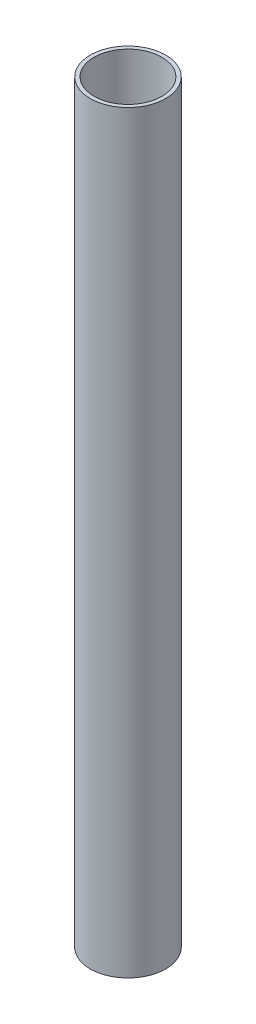
ISO-10303-21;
HEADER;
FILE_DESCRIPTION(('STEP AP214'),'2;1');
FILE_NAME('part.step','',(''),(''),'','','');
FILE_SCHEMA(('AUTOMOTIVE_DESIGN { 1 0 10303 214 1 1 1 1 }'));
ENDSEC;
DATA;
#1=APPLICATION_CONTEXT('core data for automotive mechanical design processes');
#2=APPLICATION_PROTOCOL_DEFINITION('international standard','automotive_design',2000,#1);
#3=PRODUCT_CONTEXT('',#1,'mechanical');
#4=PRODUCT('Part','Part','',(#3));
#5=PRODUCT_RELATED_PRODUCT_CATEGORY('part','',(#4));
#6=PRODUCT_DEFINITION_FORMATION('','',#4);
#7=PRODUCT_DEFINITION_CONTEXT('part definition',#1,'design');
#8=PRODUCT_DEFINITION('design','',#6,#7);
#9=PRODUCT_DEFINITION_SHAPE('','',#8);
#10=(LENGTH_UNIT() NAMED_UNIT(*) SI_UNIT(.MILLI.,.METRE.));
#11=(NAMED_UNIT(*) PLANE_ANGLE_UNIT() SI_UNIT($,.RADIAN.));
#12=(NAMED_UNIT(*) SI_UNIT($,.STERADIAN.) SOLID_ANGLE_UNIT());
#13=UNCERTAINTY_MEASURE_WITH_UNIT(LENGTH_MEASURE(1.E-05),#10,'distance_accuracy_value','');
#14=(GEOMETRIC_REPRESENTATION_CONTEXT(3) GLOBAL_UNCERTAINTY_ASSIGNED_CONTEXT((#13)) GLOBAL_UNIT_ASSIGNED_CONTEXT((#10,
#11,#12)) REPRESENTATION_CONTEXT('',''));
#15=CARTESIAN_POINT('',(0.,0.,0.));
#16=DIRECTION('',(0.,0.,1.));
#17=DIRECTION('',(1.,0.,0.));
#18=AXIS2_PLACEMENT_3D('',#15,#16,#17);
#19=CARTESIAN_POINT('',(0.,200.,0.));
#20=DIRECTION('',(0.,1.,0.));
#21=DIRECTION('',(0.,0.,1.));
#22=AXIS2_PLACEMENT_3D('',#19,#20,#21);
#23=PLANE('',#22);
#24=CARTESIAN_POINT('',(0.,200.,0.));
#25=DIRECTION('',(0.,1.,0.));
#26=DIRECTION('',(0.,0.,1.));
#27=AXIS2_PLACEMENT_3D('',#24,#25,#26);
#28=CIRCLE('',#27,10.);
#29=CARTESIAN_POINT('',(0.,200.,10.));
#30=VERTEX_POINT('',#29);
#31=EDGE_CURVE('E10',#30,#30,#28,.T.);
#32=ORIENTED_EDGE('',*,*,#31,.T.);
#33=EDGE_LOOP('',(#32));
#34=FACE_BOUND('',#33,.T.);
#35=CARTESIAN_POINT('',(0.,200.,0.));
#36=DIRECTION('',(0.,1.,0.));
#37=DIRECTION('',(0.,0.,1.));
#38=AXIS2_PLACEMENT_3D('',#35,#36,#37);
#39=CIRCLE('',#38,9.);
#40=CARTESIAN_POINT('',(0.,200.,9.));
#41=VERTEX_POINT('',#40);
#42=EDGE_CURVE('E44',#41,#41,#39,.T.);
#43=ORIENTED_EDGE('',*,*,#42,.F.);
#44=EDGE_LOOP('',(#43));
#45=FACE_BOUND('',#44,.T.);
#46=ADVANCED_FACE('F33',(#34,#45),#23,.T.);
#47=CARTESIAN_POINT('',(0.,0.,0.));
#48=DIRECTION('',(0.,1.,0.));
#49=DIRECTION('',(0.,0.,1.));
#50=AXIS2_PLACEMENT_3D('',#47,#48,#49);
#51=PLANE('',#50);
#52=CARTESIAN_POINT('',(0.,0.,0.));
#53=DIRECTION('',(0.,1.,0.));
#54=DIRECTION('',(0.,0.,1.));
#55=AXIS2_PLACEMENT_3D('',#52,#53,#54);
#56=CIRCLE('',#55,10.);
#57=CARTESIAN_POINT('',(0.,0.,10.));
#58=VERTEX_POINT('',#57);
#59=EDGE_CURVE('E37',#58,#58,#56,.T.);
#60=ORIENTED_EDGE('',*,*,#59,.F.);
#61=EDGE_LOOP('',(#60));
#62=FACE_BOUND('',#61,.T.);
#63=CARTESIAN_POINT('',(0.,0.,0.));
#64=DIRECTION('',(0.,1.,0.));
#65=DIRECTION('',(0.,0.,1.));
#66=AXIS2_PLACEMENT_3D('',#63,#64,#65);
#67=CIRCLE('',#66,9.);
#68=CARTESIAN_POINT('',(0.,0.,9.));
#69=VERTEX_POINT('',#68);
#70=EDGE_CURVE('E46',#69,#69,#67,.T.);
#71=ORIENTED_EDGE('',*,*,#70,.T.);
#72=EDGE_LOOP('',(#71));
#73=FACE_BOUND('',#72,.T.);
#74=ADVANCED_FACE('F56',(#62,#73),#51,.F.);
#75=CARTESIAN_POINT('',(0.,200.,0.));
#76=DIRECTION('',(0.,-1.,0.));
#77=DIRECTION('',(0.,0.,-1.));
#78=AXIS2_PLACEMENT_3D('',#75,#76,#77);
#79=CYLINDRICAL_SURFACE('',#78,10.);
#80=ORIENTED_EDGE('',*,*,#31,.F.);
#81=EDGE_LOOP('',(#80));
#82=FACE_BOUND('',#81,.T.);
#83=ORIENTED_EDGE('',*,*,#59,.T.);
#84=EDGE_LOOP('',(#83));
#85=FACE_BOUND('',#84,.T.);
#86=ADVANCED_FACE('F35',(#82,#85),#79,.T.);
#87=CARTESIAN_POINT('',(0.,200.,0.));
#88=DIRECTION('',(0.,-1.,0.));
#89=DIRECTION('',(0.,0.,-1.));
#90=AXIS2_PLACEMENT_3D('',#87,#88,#89);
#91=CYLINDRICAL_SURFACE('',#90,9.);
#92=ORIENTED_EDGE('',*,*,#42,.T.);
#93=EDGE_LOOP('',(#92));
#94=FACE_BOUND('',#93,.T.);
#95=ORIENTED_EDGE('',*,*,#70,.F.);
#96=EDGE_LOOP('',(#95));
#97=FACE_BOUND('',#96,.T.);
#98=ADVANCED_FACE('F52',(#94,#97),#91,.F.);
#99=CLOSED_SHELL('',(#46,#74,#86,#98));
#100=MANIFOLD_SOLID_BREP('B2',#99);
#101=ADVANCED_BREP_SHAPE_REPRESENTATION('',(#18,#100),#14);
#102=SHAPE_DEFINITION_REPRESENTATION(#9,#101);
ENDSEC;
END-ISO-10303-21;
